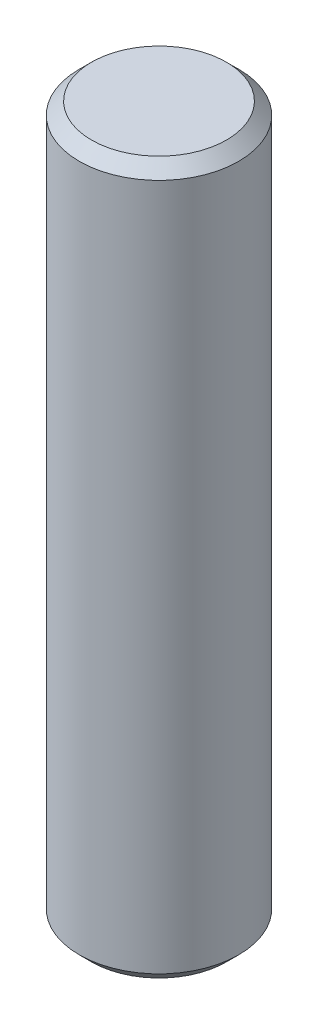
ISO-10303-21;
HEADER;
FILE_DESCRIPTION(('STEP AP214'),'2;1');
FILE_NAME('part.step','',(''),(''),'','','');
FILE_SCHEMA(('AUTOMOTIVE_DESIGN { 1 0 10303 214 1 1 1 1 }'));
ENDSEC;
DATA;
#1=APPLICATION_CONTEXT('core data for automotive mechanical design processes');
#2=APPLICATION_PROTOCOL_DEFINITION('international standard','automotive_design',2000,#1);
#3=PRODUCT_CONTEXT('',#1,'mechanical');
#4=PRODUCT('Part','Part','',(#3));
#5=PRODUCT_RELATED_PRODUCT_CATEGORY('part','',(#4));
#6=PRODUCT_DEFINITION_FORMATION('','',#4);
#7=PRODUCT_DEFINITION_CONTEXT('part definition',#1,'design');
#8=PRODUCT_DEFINITION('design','',#6,#7);
#9=PRODUCT_DEFINITION_SHAPE('','',#8);
#10=(LENGTH_UNIT() NAMED_UNIT(*) SI_UNIT(.MILLI.,.METRE.));
#11=(NAMED_UNIT(*) PLANE_ANGLE_UNIT() SI_UNIT($,.RADIAN.));
#12=(NAMED_UNIT(*) SI_UNIT($,.STERADIAN.) SOLID_ANGLE_UNIT());
#13=UNCERTAINTY_MEASURE_WITH_UNIT(LENGTH_MEASURE(1.E-05),#10,'distance_accuracy_value','');
#14=(GEOMETRIC_REPRESENTATION_CONTEXT(3) GLOBAL_UNCERTAINTY_ASSIGNED_CONTEXT((#13)) GLOBAL_UNIT_ASSIGNED_CONTEXT((#10,
#11,#12)) REPRESENTATION_CONTEXT('',''));
#15=CARTESIAN_POINT('',(0.,0.,0.));
#16=DIRECTION('',(0.,0.,1.));
#17=DIRECTION('',(1.,0.,0.));
#18=AXIS2_PLACEMENT_3D('',#15,#16,#17);
#19=CARTESIAN_POINT('',(0.,14.732,0.));
#20=DIRECTION('',(0.,-1.,0.));
#21=DIRECTION('',(0.,0.,-1.));
#22=AXIS2_PLACEMENT_3D('',#19,#20,#21);
#23=CYLINDRICAL_SURFACE('',#22,1.651);
#24=CARTESIAN_POINT('',(0.,14.478,0.));
#25=DIRECTION('',(0.,1.,0.));
#26=DIRECTION('',(0.,0.,1.));
#27=AXIS2_PLACEMENT_3D('',#24,#25,#26);
#28=CIRCLE('',#27,1.651);
#29=CARTESIAN_POINT('',(0.,14.478,1.651));
#30=VERTEX_POINT('',#29);
#31=EDGE_CURVE('E38',#30,#30,#28,.F.);
#32=ORIENTED_EDGE('',*,*,#31,.T.);
#33=EDGE_LOOP('',(#32));
#34=FACE_BOUND('',#33,.T.);
#35=CARTESIAN_POINT('',(0.,0.254000000000001,0.));
#36=DIRECTION('',(0.,1.,0.));
#37=DIRECTION('',(0.,0.,1.));
#38=AXIS2_PLACEMENT_3D('',#35,#36,#37);
#39=CIRCLE('',#38,1.651);
#40=CARTESIAN_POINT('',(0.,0.254000000000001,1.651));
#41=VERTEX_POINT('',#40);
#42=EDGE_CURVE('E42',#41,#41,#39,.T.);
#43=ORIENTED_EDGE('',*,*,#42,.T.);
#44=EDGE_LOOP('',(#43));
#45=FACE_BOUND('',#44,.T.);
#46=ADVANCED_FACE('F31',(#34,#45),#23,.T.);
#47=CARTESIAN_POINT('',(0.,14.732,0.));
#48=DIRECTION('',(0.,1.,0.));
#49=DIRECTION('',(0.,0.,1.));
#50=AXIS2_PLACEMENT_3D('',#47,#48,#49);
#51=PLANE('',#50);
#52=CARTESIAN_POINT('',(0.,14.732,0.));
#53=DIRECTION('',(0.,1.,0.));
#54=DIRECTION('',(0.,0.,1.));
#55=AXIS2_PLACEMENT_3D('',#52,#53,#54);
#56=CIRCLE('',#55,1.397);
#57=CARTESIAN_POINT('',(0.,14.732,1.397));
#58=VERTEX_POINT('',#57);
#59=EDGE_CURVE('E46',#58,#58,#56,.T.);
#60=ORIENTED_EDGE('',*,*,#59,.T.);
#61=EDGE_LOOP('',(#60));
#62=FACE_BOUND('',#61,.T.);
#63=ADVANCED_FACE('F52',(#62),#51,.T.);
#64=CARTESIAN_POINT('',(0.,0.,0.));
#65=DIRECTION('',(0.,1.,0.));
#66=DIRECTION('',(0.,0.,1.));
#67=AXIS2_PLACEMENT_3D('',#64,#65,#66);
#68=PLANE('',#67);
#69=CARTESIAN_POINT('',(0.,0.,0.));
#70=DIRECTION('',(0.,1.,0.));
#71=DIRECTION('',(0.,0.,1.));
#72=AXIS2_PLACEMENT_3D('',#69,#70,#71);
#73=CIRCLE('',#72,1.397);
#74=CARTESIAN_POINT('',(0.,0.,1.397));
#75=VERTEX_POINT('',#74);
#76=EDGE_CURVE('E10',#75,#75,#73,.F.);
#77=ORIENTED_EDGE('',*,*,#76,.T.);
#78=EDGE_LOOP('',(#77));
#79=FACE_BOUND('',#78,.T.);
#80=ADVANCED_FACE('F56',(#79),#68,.F.);
#81=CARTESIAN_POINT('',(0.,14.732,0.));
#82=DIRECTION('',(0.,-1.,0.));
#83=DIRECTION('',(0.,0.,-1.));
#84=AXIS2_PLACEMENT_3D('',#81,#82,#83);
#85=CONICAL_SURFACE('',#84,1.397,0.785398163397449);
#86=ORIENTED_EDGE('',*,*,#31,.F.);
#87=EDGE_LOOP('',(#86));
#88=FACE_BOUND('',#87,.T.);
#89=ORIENTED_EDGE('',*,*,#59,.F.);
#90=EDGE_LOOP('',(#89));
#91=FACE_BOUND('',#90,.T.);
#92=ADVANCED_FACE('F54',(#88,#91),#85,.T.);
#93=CARTESIAN_POINT('',(0.,0.254000000000001,0.));
#94=DIRECTION('',(0.,1.,0.));
#95=DIRECTION('',(0.,0.,1.));
#96=AXIS2_PLACEMENT_3D('',#93,#94,#95);
#97=CONICAL_SURFACE('',#96,1.651,0.785398163397445);
#98=ORIENTED_EDGE('',*,*,#76,.F.);
#99=EDGE_LOOP('',(#98));
#100=FACE_BOUND('',#99,.T.);
#101=ORIENTED_EDGE('',*,*,#42,.F.);
#102=EDGE_LOOP('',(#101));
#103=FACE_BOUND('',#102,.T.);
#104=ADVANCED_FACE('F33',(#100,#103),#97,.T.);
#105=CLOSED_SHELL('',(#46,#63,#80,#92,#104));
#106=MANIFOLD_SOLID_BREP('B2',#105);
#107=ADVANCED_BREP_SHAPE_REPRESENTATION('',(#18,#106),#14);
#108=SHAPE_DEFINITION_REPRESENTATION(#9,#107);
ENDSEC;
END-ISO-10303-21;
